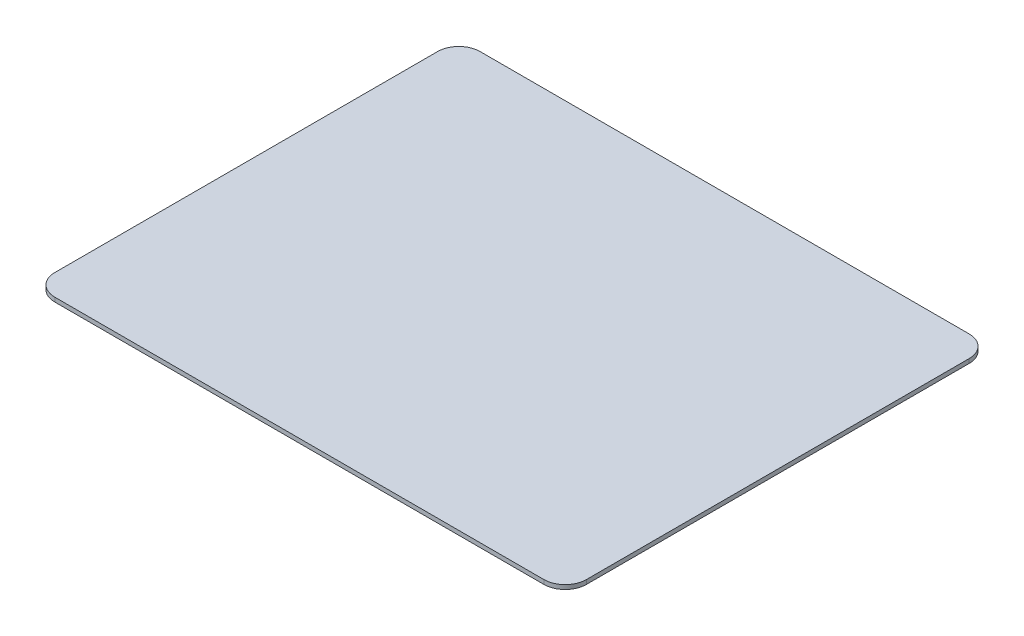
ISO-10303-21;
HEADER;
FILE_DESCRIPTION(('STEP AP214'),'2;1');
FILE_NAME('part.step','',(''),(''),'','','');
FILE_SCHEMA(('AUTOMOTIVE_DESIGN { 1 0 10303 214 1 1 1 1 }'));
ENDSEC;
DATA;
#1=APPLICATION_CONTEXT('core data for automotive mechanical design processes');
#2=APPLICATION_PROTOCOL_DEFINITION('international standard','automotive_design',2000,#1);
#3=PRODUCT_CONTEXT('',#1,'mechanical');
#4=PRODUCT('Part','Part','',(#3));
#5=PRODUCT_RELATED_PRODUCT_CATEGORY('part','',(#4));
#6=PRODUCT_DEFINITION_FORMATION('','',#4);
#7=PRODUCT_DEFINITION_CONTEXT('part definition',#1,'design');
#8=PRODUCT_DEFINITION('design','',#6,#7);
#9=PRODUCT_DEFINITION_SHAPE('','',#8);
#10=(LENGTH_UNIT() NAMED_UNIT(*) SI_UNIT(.MILLI.,.METRE.));
#11=(NAMED_UNIT(*) PLANE_ANGLE_UNIT() SI_UNIT($,.RADIAN.));
#12=(NAMED_UNIT(*) SI_UNIT($,.STERADIAN.) SOLID_ANGLE_UNIT());
#13=UNCERTAINTY_MEASURE_WITH_UNIT(LENGTH_MEASURE(1.E-05),#10,'distance_accuracy_value','');
#14=(GEOMETRIC_REPRESENTATION_CONTEXT(3) GLOBAL_UNCERTAINTY_ASSIGNED_CONTEXT((#13)) GLOBAL_UNIT_ASSIGNED_CONTEXT((#10,
#11,#12)) REPRESENTATION_CONTEXT('',''));
#15=CARTESIAN_POINT('',(0.,0.,0.));
#16=DIRECTION('',(0.,0.,1.));
#17=DIRECTION('',(1.,0.,0.));
#18=AXIS2_PLACEMENT_3D('',#15,#16,#17);
#19=CARTESIAN_POINT('',(-115.,-2.,-90.));
#20=DIRECTION('',(0.,1.,0.));
#21=DIRECTION('',(0.,0.,1.));
#22=AXIS2_PLACEMENT_3D('',#19,#20,#21);
#23=CYLINDRICAL_SURFACE('',#22,9.99999999999999);
#24=CARTESIAN_POINT('',(-115.,0.,-90.));
#25=DIRECTION('',(0.,1.,0.));
#26=DIRECTION('',(0.,0.,-1.));
#27=AXIS2_PLACEMENT_3D('',#24,#25,#26);
#28=CIRCLE('',#27,9.99999999999999);
#29=CARTESIAN_POINT('',(-115.,0.,-100.));
#30=VERTEX_POINT('',#29);
#31=CARTESIAN_POINT('',(-125.,0.,-89.9999999999999));
#32=VERTEX_POINT('',#31);
#33=EDGE_CURVE('E134',#30,#32,#28,.T.);
#34=ORIENTED_EDGE('',*,*,#33,.F.);
#35=DIRECTION('',(0.,1.,0.));
#36=VECTOR('',#35,1.);
#37=CARTESIAN_POINT('',(-115.,-2.,-100.));
#38=LINE('',#37,#36);
#39=CARTESIAN_POINT('',(-115.,-2.,-100.));
#40=VERTEX_POINT('',#39);
#41=EDGE_CURVE('E11',#40,#30,#38,.T.);
#42=ORIENTED_EDGE('',*,*,#41,.F.);
#43=CARTESIAN_POINT('',(-115.,-2.,-90.));
#44=DIRECTION('',(0.,1.,0.));
#45=DIRECTION('',(0.,0.,-1.));
#46=AXIS2_PLACEMENT_3D('',#43,#44,#45);
#47=CIRCLE('',#46,9.99999999999999);
#48=CARTESIAN_POINT('',(-125.,-2.,-89.9999999999999));
#49=VERTEX_POINT('',#48);
#50=EDGE_CURVE('E154',#40,#49,#47,.T.);
#51=ORIENTED_EDGE('',*,*,#50,.T.);
#52=DIRECTION('',(0.,1.,0.));
#53=VECTOR('',#52,1.);
#54=CARTESIAN_POINT('',(-125.,-2.,-89.9999999999999));
#55=LINE('',#54,#53);
#56=EDGE_CURVE('E40',#49,#32,#55,.T.);
#57=ORIENTED_EDGE('',*,*,#56,.T.);
#58=EDGE_LOOP('',(#34,#42,#51,#57));
#59=FACE_BOUND('',#58,.T.);
#60=ADVANCED_FACE('F37',(#59),#23,.T.);
#61=CARTESIAN_POINT('',(-115.,-2.,-100.));
#62=DIRECTION('',(0.,0.,-1.));
#63=DIRECTION('',(-1.,0.,0.));
#64=AXIS2_PLACEMENT_3D('',#61,#62,#63);
#65=PLANE('',#64);
#66=DIRECTION('',(-1.,0.,0.));
#67=VECTOR('',#66,1.);
#68=CARTESIAN_POINT('',(-115.,0.,-100.));
#69=LINE('',#68,#67);
#70=CARTESIAN_POINT('',(115.,0.,-100.));
#71=VERTEX_POINT('',#70);
#72=EDGE_CURVE('E152',#71,#30,#69,.T.);
#73=ORIENTED_EDGE('',*,*,#72,.F.);
#74=DIRECTION('',(0.,1.,0.));
#75=VECTOR('',#74,1.);
#76=CARTESIAN_POINT('',(115.,-2.,-100.));
#77=LINE('',#76,#75);
#78=CARTESIAN_POINT('',(115.,-2.,-100.));
#79=VERTEX_POINT('',#78);
#80=EDGE_CURVE('E46',#79,#71,#77,.T.);
#81=ORIENTED_EDGE('',*,*,#80,.F.);
#82=DIRECTION('',(-1.,0.,0.));
#83=VECTOR('',#82,1.);
#84=CARTESIAN_POINT('',(-115.,-2.,-100.));
#85=LINE('',#84,#83);
#86=EDGE_CURVE('E124',#79,#40,#85,.T.);
#87=ORIENTED_EDGE('',*,*,#86,.T.);
#88=ORIENTED_EDGE('',*,*,#41,.T.);
#89=EDGE_LOOP('',(#73,#81,#87,#88));
#90=FACE_BOUND('',#89,.T.);
#91=ADVANCED_FACE('F166',(#90),#65,.T.);
#92=CARTESIAN_POINT('',(115.,-2.,-90.));
#93=DIRECTION('',(0.,1.,0.));
#94=DIRECTION('',(0.,0.,1.));
#95=AXIS2_PLACEMENT_3D('',#92,#93,#94);
#96=CYLINDRICAL_SURFACE('',#95,9.99999999999999);
#97=CARTESIAN_POINT('',(115.,0.,-90.));
#98=DIRECTION('',(0.,1.,0.));
#99=DIRECTION('',(0.,0.,-1.));
#100=AXIS2_PLACEMENT_3D('',#97,#98,#99);
#101=CIRCLE('',#100,9.99999999999999);
#102=CARTESIAN_POINT('',(125.,0.,-89.9999999999999));
#103=VERTEX_POINT('',#102);
#104=EDGE_CURVE('E111',#103,#71,#101,.T.);
#105=ORIENTED_EDGE('',*,*,#104,.F.);
#106=DIRECTION('',(0.,1.,0.));
#107=VECTOR('',#106,1.);
#108=CARTESIAN_POINT('',(125.,-2.,-89.9999999999999));
#109=LINE('',#108,#107);
#110=CARTESIAN_POINT('',(125.,-2.,-89.9999999999999));
#111=VERTEX_POINT('',#110);
#112=EDGE_CURVE('E106',#111,#103,#109,.T.);
#113=ORIENTED_EDGE('',*,*,#112,.F.);
#114=CARTESIAN_POINT('',(115.,-2.,-90.));
#115=DIRECTION('',(0.,1.,0.));
#116=DIRECTION('',(0.,0.,-1.));
#117=AXIS2_PLACEMENT_3D('',#114,#115,#116);
#118=CIRCLE('',#117,9.99999999999999);
#119=EDGE_CURVE('E109',#111,#79,#118,.T.);
#120=ORIENTED_EDGE('',*,*,#119,.T.);
#121=ORIENTED_EDGE('',*,*,#80,.T.);
#122=EDGE_LOOP('',(#105,#113,#120,#121));
#123=FACE_BOUND('',#122,.T.);
#124=ADVANCED_FACE('F108',(#123),#96,.T.);
#125=CARTESIAN_POINT('',(125.,-2.,89.9999999999999));
#126=DIRECTION('',(1.,0.,0.));
#127=DIRECTION('',(0.,0.,-1.));
#128=AXIS2_PLACEMENT_3D('',#125,#126,#127);
#129=PLANE('',#128);
#130=DIRECTION('',(0.,0.,-1.));
#131=VECTOR('',#130,1.);
#132=CARTESIAN_POINT('',(125.,0.,89.9999999999999));
#133=LINE('',#132,#131);
#134=CARTESIAN_POINT('',(125.,0.,89.9999999999999));
#135=VERTEX_POINT('',#134);
#136=EDGE_CURVE('E149',#135,#103,#133,.T.);
#137=ORIENTED_EDGE('',*,*,#136,.F.);
#138=DIRECTION('',(0.,1.,0.));
#139=VECTOR('',#138,1.);
#140=CARTESIAN_POINT('',(125.,-2.,89.9999999999999));
#141=LINE('',#140,#139);
#142=CARTESIAN_POINT('',(125.,-2.,89.9999999999999));
#143=VERTEX_POINT('',#142);
#144=EDGE_CURVE('E116',#143,#135,#141,.T.);
#145=ORIENTED_EDGE('',*,*,#144,.F.);
#146=DIRECTION('',(0.,0.,-1.));
#147=VECTOR('',#146,1.);
#148=CARTESIAN_POINT('',(125.,-2.,89.9999999999999));
#149=LINE('',#148,#147);
#150=EDGE_CURVE('E122',#143,#111,#149,.T.);
#151=ORIENTED_EDGE('',*,*,#150,.T.);
#152=ORIENTED_EDGE('',*,*,#112,.T.);
#153=EDGE_LOOP('',(#137,#145,#151,#152));
#154=FACE_BOUND('',#153,.T.);
#155=ADVANCED_FACE('F126',(#154),#129,.T.);
#156=CARTESIAN_POINT('',(115.,-2.,90.));
#157=DIRECTION('',(0.,1.,0.));
#158=DIRECTION('',(0.,0.,1.));
#159=AXIS2_PLACEMENT_3D('',#156,#157,#158);
#160=CYLINDRICAL_SURFACE('',#159,9.99999999999999);
#161=CARTESIAN_POINT('',(115.,0.,90.));
#162=DIRECTION('',(0.,1.,0.));
#163=DIRECTION('',(0.,0.,1.));
#164=AXIS2_PLACEMENT_3D('',#161,#162,#163);
#165=CIRCLE('',#164,9.99999999999999);
#166=CARTESIAN_POINT('',(115.,0.,100.));
#167=VERTEX_POINT('',#166);
#168=EDGE_CURVE('E146',#167,#135,#165,.T.);
#169=ORIENTED_EDGE('',*,*,#168,.F.);
#170=DIRECTION('',(0.,1.,0.));
#171=VECTOR('',#170,1.);
#172=CARTESIAN_POINT('',(115.,-2.,100.));
#173=LINE('',#172,#171);
#174=CARTESIAN_POINT('',(115.,-2.,100.));
#175=VERTEX_POINT('',#174);
#176=EDGE_CURVE('E158',#175,#167,#173,.T.);
#177=ORIENTED_EDGE('',*,*,#176,.F.);
#178=CARTESIAN_POINT('',(115.,-2.,90.));
#179=DIRECTION('',(0.,1.,0.));
#180=DIRECTION('',(0.,0.,1.));
#181=AXIS2_PLACEMENT_3D('',#178,#179,#180);
#182=CIRCLE('',#181,9.99999999999999);
#183=EDGE_CURVE('E127',#175,#143,#182,.T.);
#184=ORIENTED_EDGE('',*,*,#183,.T.);
#185=ORIENTED_EDGE('',*,*,#144,.T.);
#186=EDGE_LOOP('',(#169,#177,#184,#185));
#187=FACE_BOUND('',#186,.T.);
#188=ADVANCED_FACE('F179',(#187),#160,.T.);
#189=CARTESIAN_POINT('',(-115.,-2.,100.));
#190=DIRECTION('',(0.,0.,1.));
#191=DIRECTION('',(1.,0.,0.));
#192=AXIS2_PLACEMENT_3D('',#189,#190,#191);
#193=PLANE('',#192);
#194=DIRECTION('',(1.,0.,0.));
#195=VECTOR('',#194,1.);
#196=CARTESIAN_POINT('',(-115.,0.,100.));
#197=LINE('',#196,#195);
#198=CARTESIAN_POINT('',(-115.,0.,100.));
#199=VERTEX_POINT('',#198);
#200=EDGE_CURVE('E143',#199,#167,#197,.T.);
#201=ORIENTED_EDGE('',*,*,#200,.F.);
#202=DIRECTION('',(0.,1.,0.));
#203=VECTOR('',#202,1.);
#204=CARTESIAN_POINT('',(-115.,-2.,100.));
#205=LINE('',#204,#203);
#206=CARTESIAN_POINT('',(-115.,-2.,100.));
#207=VERTEX_POINT('',#206);
#208=EDGE_CURVE('E160',#207,#199,#205,.T.);
#209=ORIENTED_EDGE('',*,*,#208,.F.);
#210=DIRECTION('',(1.,0.,0.));
#211=VECTOR('',#210,1.);
#212=CARTESIAN_POINT('',(-115.,-2.,100.));
#213=LINE('',#212,#211);
#214=EDGE_CURVE('E129',#207,#175,#213,.T.);
#215=ORIENTED_EDGE('',*,*,#214,.T.);
#216=ORIENTED_EDGE('',*,*,#176,.T.);
#217=EDGE_LOOP('',(#201,#209,#215,#216));
#218=FACE_BOUND('',#217,.T.);
#219=ADVANCED_FACE('F182',(#218),#193,.T.);
#220=CARTESIAN_POINT('',(-115.,-2.,90.));
#221=DIRECTION('',(0.,1.,0.));
#222=DIRECTION('',(0.,0.,1.));
#223=AXIS2_PLACEMENT_3D('',#220,#221,#222);
#224=CYLINDRICAL_SURFACE('',#223,9.99999999999999);
#225=CARTESIAN_POINT('',(-115.,0.,90.));
#226=DIRECTION('',(0.,1.,0.));
#227=DIRECTION('',(0.,0.,-1.));
#228=AXIS2_PLACEMENT_3D('',#225,#226,#227);
#229=CIRCLE('',#228,9.99999999999999);
#230=CARTESIAN_POINT('',(-125.,0.,89.9999999999999));
#231=VERTEX_POINT('',#230);
#232=EDGE_CURVE('E140',#231,#199,#229,.T.);
#233=ORIENTED_EDGE('',*,*,#232,.F.);
#234=DIRECTION('',(0.,1.,0.));
#235=VECTOR('',#234,1.);
#236=CARTESIAN_POINT('',(-125.,-2.,89.9999999999999));
#237=LINE('',#236,#235);
#238=CARTESIAN_POINT('',(-125.,-2.,89.9999999999999));
#239=VERTEX_POINT('',#238);
#240=EDGE_CURVE('E161',#239,#231,#237,.T.);
#241=ORIENTED_EDGE('',*,*,#240,.F.);
#242=CARTESIAN_POINT('',(-115.,-2.,90.));
#243=DIRECTION('',(0.,1.,0.));
#244=DIRECTION('',(0.,0.,-1.));
#245=AXIS2_PLACEMENT_3D('',#242,#243,#244);
#246=CIRCLE('',#245,9.99999999999999);
#247=EDGE_CURVE('E277',#239,#207,#246,.T.);
#248=ORIENTED_EDGE('',*,*,#247,.T.);
#249=ORIENTED_EDGE('',*,*,#208,.T.);
#250=EDGE_LOOP('',(#233,#241,#248,#249));
#251=FACE_BOUND('',#250,.T.);
#252=ADVANCED_FACE('F186',(#251),#224,.T.);
#253=CARTESIAN_POINT('',(-125.,-2.,89.9999999999999));
#254=DIRECTION('',(-1.,0.,0.));
#255=DIRECTION('',(0.,0.,1.));
#256=AXIS2_PLACEMENT_3D('',#253,#254,#255);
#257=PLANE('',#256);
#258=DIRECTION('',(0.,0.,1.));
#259=VECTOR('',#258,1.);
#260=CARTESIAN_POINT('',(-125.,0.,89.9999999999999));
#261=LINE('',#260,#259);
#262=EDGE_CURVE('E137',#32,#231,#261,.T.);
#263=ORIENTED_EDGE('',*,*,#262,.F.);
#264=ORIENTED_EDGE('',*,*,#56,.F.);
#265=DIRECTION('',(0.,0.,1.));
#266=VECTOR('',#265,1.);
#267=CARTESIAN_POINT('',(-125.,-2.,89.9999999999999));
#268=LINE('',#267,#266);
#269=EDGE_CURVE('E278',#49,#239,#268,.T.);
#270=ORIENTED_EDGE('',*,*,#269,.T.);
#271=ORIENTED_EDGE('',*,*,#240,.T.);
#272=EDGE_LOOP('',(#263,#264,#270,#271));
#273=FACE_BOUND('',#272,.T.);
#274=ADVANCED_FACE('F163',(#273),#257,.T.);
#275=CARTESIAN_POINT('',(-115.,-2.,-90.));
#276=DIRECTION('',(0.,-1.,0.));
#277=DIRECTION('',(0.,0.,-1.));
#278=AXIS2_PLACEMENT_3D('',#275,#276,#277);
#279=PLANE('',#278);
#280=ORIENTED_EDGE('',*,*,#50,.F.);
#281=ORIENTED_EDGE('',*,*,#86,.F.);
#282=ORIENTED_EDGE('',*,*,#119,.F.);
#283=ORIENTED_EDGE('',*,*,#150,.F.);
#284=ORIENTED_EDGE('',*,*,#183,.F.);
#285=ORIENTED_EDGE('',*,*,#214,.F.);
#286=ORIENTED_EDGE('',*,*,#247,.F.);
#287=ORIENTED_EDGE('',*,*,#269,.F.);
#288=EDGE_LOOP('',(#280,#281,#282,#283,#284,#285,#286,#287));
#289=FACE_BOUND('',#288,.T.);
#290=ADVANCED_FACE('F120',(#289),#279,.T.);
#291=CARTESIAN_POINT('',(-115.,0.,-90.));
#292=DIRECTION('',(0.,-1.,0.));
#293=DIRECTION('',(0.,0.,-1.));
#294=AXIS2_PLACEMENT_3D('',#291,#292,#293);
#295=PLANE('',#294);
#296=ORIENTED_EDGE('',*,*,#33,.T.);
#297=ORIENTED_EDGE('',*,*,#262,.T.);
#298=ORIENTED_EDGE('',*,*,#232,.T.);
#299=ORIENTED_EDGE('',*,*,#200,.T.);
#300=ORIENTED_EDGE('',*,*,#168,.T.);
#301=ORIENTED_EDGE('',*,*,#136,.T.);
#302=ORIENTED_EDGE('',*,*,#104,.T.);
#303=ORIENTED_EDGE('',*,*,#72,.T.);
#304=EDGE_LOOP('',(#296,#297,#298,#299,#300,#301,#302,#303));
#305=FACE_BOUND('',#304,.T.);
#306=ADVANCED_FACE('F165',(#305),#295,.F.);
#307=CLOSED_SHELL('',(#60,#91,#124,#155,#188,#219,#252,#274,#290,#306));
#308=MANIFOLD_SOLID_BREP('B2',#307);
#309=ADVANCED_BREP_SHAPE_REPRESENTATION('',(#18,#308),#14);
#310=SHAPE_DEFINITION_REPRESENTATION(#9,#309);
ENDSEC;
END-ISO-10303-21;
